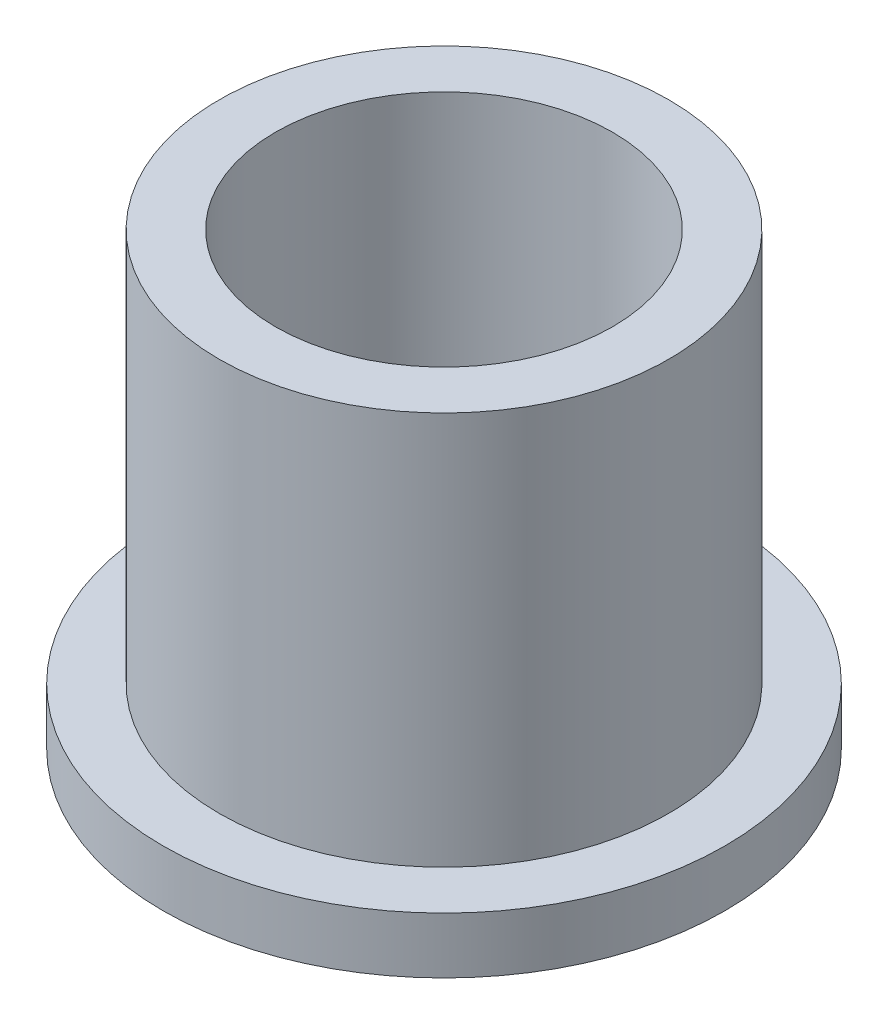
ISO-10303-21;
HEADER;
FILE_DESCRIPTION(('STEP AP214'),'2;1');
FILE_NAME('part.step','',(''),(''),'','','');
FILE_SCHEMA(('AUTOMOTIVE_DESIGN { 1 0 10303 214 1 1 1 1 }'));
ENDSEC;
DATA;
#1=APPLICATION_CONTEXT('core data for automotive mechanical design processes');
#2=APPLICATION_PROTOCOL_DEFINITION('international standard','automotive_design',2000,#1);
#3=PRODUCT_CONTEXT('',#1,'mechanical');
#4=PRODUCT('Part','Part','',(#3));
#5=PRODUCT_RELATED_PRODUCT_CATEGORY('part','',(#4));
#6=PRODUCT_DEFINITION_FORMATION('','',#4);
#7=PRODUCT_DEFINITION_CONTEXT('part definition',#1,'design');
#8=PRODUCT_DEFINITION('design','',#6,#7);
#9=PRODUCT_DEFINITION_SHAPE('','',#8);
#10=(LENGTH_UNIT() NAMED_UNIT(*) SI_UNIT(.MILLI.,.METRE.));
#11=(NAMED_UNIT(*) PLANE_ANGLE_UNIT() SI_UNIT($,.RADIAN.));
#12=(NAMED_UNIT(*) SI_UNIT($,.STERADIAN.) SOLID_ANGLE_UNIT());
#13=UNCERTAINTY_MEASURE_WITH_UNIT(LENGTH_MEASURE(1.E-05),#10,'distance_accuracy_value','');
#14=(GEOMETRIC_REPRESENTATION_CONTEXT(3) GLOBAL_UNCERTAINTY_ASSIGNED_CONTEXT((#13)) GLOBAL_UNIT_ASSIGNED_CONTEXT((#10,
#11,#12)) REPRESENTATION_CONTEXT('',''));
#15=CARTESIAN_POINT('',(0.,0.,0.));
#16=DIRECTION('',(0.,0.,1.));
#17=DIRECTION('',(1.,0.,0.));
#18=AXIS2_PLACEMENT_3D('',#15,#16,#17);
#19=CARTESIAN_POINT('',(0.,12.7,0.));
#20=DIRECTION('',(0.,1.,0.));
#21=DIRECTION('',(0.,0.,1.));
#22=AXIS2_PLACEMENT_3D('',#19,#20,#21);
#23=PLANE('',#22);
#24=CARTESIAN_POINT('',(0.,12.7,0.));
#25=DIRECTION('',(0.,1.,0.));
#26=DIRECTION('',(0.,0.,1.));
#27=AXIS2_PLACEMENT_3D('',#24,#25,#26);
#28=CIRCLE('',#27,6.35);
#29=CARTESIAN_POINT('',(0.,12.7,6.35));
#30=VERTEX_POINT('',#29);
#31=EDGE_CURVE('E10',#30,#30,#28,.T.);
#32=ORIENTED_EDGE('',*,*,#31,.T.);
#33=EDGE_LOOP('',(#32));
#34=FACE_BOUND('',#33,.T.);
#35=CARTESIAN_POINT('',(0.,12.7,0.));
#36=DIRECTION('',(0.,1.,0.));
#37=DIRECTION('',(0.,0.,1.));
#38=AXIS2_PLACEMENT_3D('',#35,#36,#37);
#39=CIRCLE('',#38,4.7625);
#40=CARTESIAN_POINT('',(0.,12.7,4.7625));
#41=VERTEX_POINT('',#40);
#42=EDGE_CURVE('E37',#41,#41,#39,.T.);
#43=ORIENTED_EDGE('',*,*,#42,.F.);
#44=EDGE_LOOP('',(#43));
#45=FACE_BOUND('',#44,.T.);
#46=ADVANCED_FACE('F30',(#34,#45),#23,.T.);
#47=CARTESIAN_POINT('',(0.,0.,0.));
#48=DIRECTION('',(0.,1.,0.));
#49=DIRECTION('',(0.,0.,1.));
#50=AXIS2_PLACEMENT_3D('',#47,#48,#49);
#51=PLANE('',#50);
#52=CARTESIAN_POINT('',(0.,0.,0.));
#53=DIRECTION('',(0.,1.,0.));
#54=DIRECTION('',(0.,0.,1.));
#55=AXIS2_PLACEMENT_3D('',#52,#53,#54);
#56=CIRCLE('',#55,4.7625);
#57=CARTESIAN_POINT('',(0.,0.,4.7625));
#58=VERTEX_POINT('',#57);
#59=EDGE_CURVE('E41',#58,#58,#56,.T.);
#60=ORIENTED_EDGE('',*,*,#59,.T.);
#61=EDGE_LOOP('',(#60));
#62=FACE_BOUND('',#61,.T.);
#63=CARTESIAN_POINT('',(0.,0.,0.));
#64=DIRECTION('',(0.,1.,0.));
#65=DIRECTION('',(0.,0.,1.));
#66=AXIS2_PLACEMENT_3D('',#63,#64,#65);
#67=CIRCLE('',#66,7.9375);
#68=CARTESIAN_POINT('',(0.,0.,7.9375));
#69=VERTEX_POINT('',#68);
#70=EDGE_CURVE('E48',#69,#69,#67,.T.);
#71=ORIENTED_EDGE('',*,*,#70,.F.);
#72=EDGE_LOOP('',(#71));
#73=FACE_BOUND('',#72,.T.);
#74=ADVANCED_FACE('F73',(#62,#73),#51,.F.);
#75=CARTESIAN_POINT('',(0.,12.7,0.));
#76=DIRECTION('',(0.,-1.,0.));
#77=DIRECTION('',(0.,0.,-1.));
#78=AXIS2_PLACEMENT_3D('',#75,#76,#77);
#79=CYLINDRICAL_SURFACE('',#78,6.35);
#80=CARTESIAN_POINT('',(0.,1.5875,0.));
#81=DIRECTION('',(0.,1.,0.));
#82=DIRECTION('',(0.,0.,1.));
#83=AXIS2_PLACEMENT_3D('',#80,#81,#82);
#84=CIRCLE('',#83,6.35);
#85=CARTESIAN_POINT('',(0.,1.5875,6.35));
#86=VERTEX_POINT('',#85);
#87=EDGE_CURVE('E51',#86,#86,#84,.T.);
#88=ORIENTED_EDGE('',*,*,#87,.T.);
#89=EDGE_LOOP('',(#88));
#90=FACE_BOUND('',#89,.T.);
#91=ORIENTED_EDGE('',*,*,#31,.F.);
#92=EDGE_LOOP('',(#91));
#93=FACE_BOUND('',#92,.T.);
#94=ADVANCED_FACE('F32',(#90,#93),#79,.T.);
#95=CARTESIAN_POINT('',(0.,12.7,0.));
#96=DIRECTION('',(0.,-1.,0.));
#97=DIRECTION('',(0.,0.,-1.));
#98=AXIS2_PLACEMENT_3D('',#95,#96,#97);
#99=CYLINDRICAL_SURFACE('',#98,4.7625);
#100=ORIENTED_EDGE('',*,*,#42,.T.);
#101=EDGE_LOOP('',(#100));
#102=FACE_BOUND('',#101,.T.);
#103=ORIENTED_EDGE('',*,*,#59,.F.);
#104=EDGE_LOOP('',(#103));
#105=FACE_BOUND('',#104,.T.);
#106=ADVANCED_FACE('F62',(#102,#105),#99,.F.);
#107=CARTESIAN_POINT('',(0.,1.5875,0.));
#108=DIRECTION('',(0.,1.,0.));
#109=DIRECTION('',(0.,0.,1.));
#110=AXIS2_PLACEMENT_3D('',#107,#108,#109);
#111=PLANE('',#110);
#112=CARTESIAN_POINT('',(0.,1.5875,0.));
#113=DIRECTION('',(0.,1.,0.));
#114=DIRECTION('',(0.,0.,1.));
#115=AXIS2_PLACEMENT_3D('',#112,#113,#114);
#116=CIRCLE('',#115,7.9375);
#117=CARTESIAN_POINT('',(0.,1.5875,7.9375));
#118=VERTEX_POINT('',#117);
#119=EDGE_CURVE('E46',#118,#118,#116,.T.);
#120=ORIENTED_EDGE('',*,*,#119,.T.);
#121=EDGE_LOOP('',(#120));
#122=FACE_BOUND('',#121,.T.);
#123=ORIENTED_EDGE('',*,*,#87,.F.);
#124=EDGE_LOOP('',(#123));
#125=FACE_BOUND('',#124,.T.);
#126=ADVANCED_FACE('F59',(#122,#125),#111,.T.);
#127=CARTESIAN_POINT('',(0.,1.5875,0.));
#128=DIRECTION('',(0.,-1.,0.));
#129=DIRECTION('',(0.,0.,-1.));
#130=AXIS2_PLACEMENT_3D('',#127,#128,#129);
#131=CYLINDRICAL_SURFACE('',#130,7.9375);
#132=ORIENTED_EDGE('',*,*,#119,.F.);
#133=EDGE_LOOP('',(#132));
#134=FACE_BOUND('',#133,.T.);
#135=ORIENTED_EDGE('',*,*,#70,.T.);
#136=EDGE_LOOP('',(#135));
#137=FACE_BOUND('',#136,.T.);
#138=ADVANCED_FACE('F61',(#134,#137),#131,.T.);
#139=CLOSED_SHELL('',(#46,#74,#94,#106,#126,#138));
#140=MANIFOLD_SOLID_BREP('B2',#139);
#141=ADVANCED_BREP_SHAPE_REPRESENTATION('',(#18,#140),#14);
#142=SHAPE_DEFINITION_REPRESENTATION(#9,#141);
ENDSEC;
END-ISO-10303-21;
